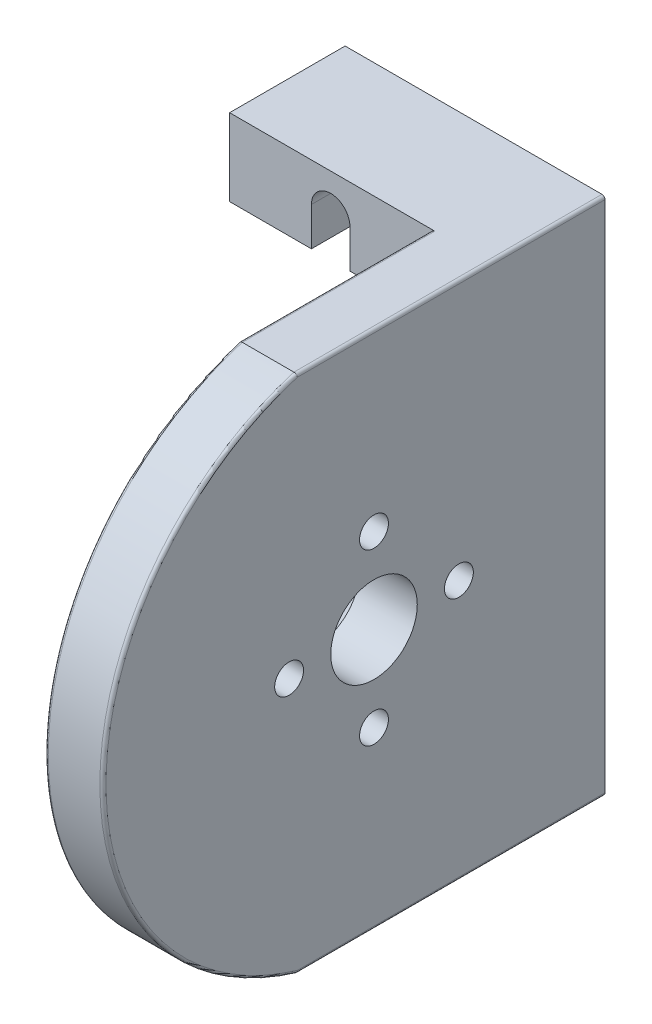
ISO-10303-21;
HEADER;
FILE_DESCRIPTION(('STEP AP214'),'2;1');
FILE_NAME('part.step','',(''),(''),'','','');
FILE_SCHEMA(('AUTOMOTIVE_DESIGN { 1 0 10303 214 1 1 1 1 }'));
ENDSEC;
DATA;
#1=APPLICATION_CONTEXT('core data for automotive mechanical design processes');
#2=APPLICATION_PROTOCOL_DEFINITION('international standard','automotive_design',2000,#1);
#3=PRODUCT_CONTEXT('',#1,'mechanical');
#4=PRODUCT('Part','Part','',(#3));
#5=PRODUCT_RELATED_PRODUCT_CATEGORY('part','',(#4));
#6=PRODUCT_DEFINITION_FORMATION('','',#4);
#7=PRODUCT_DEFINITION_CONTEXT('part definition',#1,'design');
#8=PRODUCT_DEFINITION('design','',#6,#7);
#9=PRODUCT_DEFINITION_SHAPE('','',#8);
#10=(LENGTH_UNIT() NAMED_UNIT(*) SI_UNIT(.MILLI.,.METRE.));
#11=(NAMED_UNIT(*) PLANE_ANGLE_UNIT() SI_UNIT($,.RADIAN.));
#12=(NAMED_UNIT(*) SI_UNIT($,.STERADIAN.) SOLID_ANGLE_UNIT());
#13=UNCERTAINTY_MEASURE_WITH_UNIT(LENGTH_MEASURE(1.E-05),#10,'distance_accuracy_value','');
#14=(GEOMETRIC_REPRESENTATION_CONTEXT(3) GLOBAL_UNCERTAINTY_ASSIGNED_CONTEXT((#13)) GLOBAL_UNIT_ASSIGNED_CONTEXT((#10,
#11,#12)) REPRESENTATION_CONTEXT('',''));
#15=CARTESIAN_POINT('',(0.,0.,0.));
#16=DIRECTION('',(0.,0.,1.));
#17=DIRECTION('',(1.,0.,0.));
#18=AXIS2_PLACEMENT_3D('',#15,#16,#17);
#19=CARTESIAN_POINT('',(0.,36.5125,25.4));
#20=DIRECTION('',(0.,1.,0.));
#21=DIRECTION('',(0.,0.,1.));
#22=AXIS2_PLACEMENT_3D('',#19,#20,#21);
#23=PLANE('',#22);
#24=DIRECTION('',(1.,0.,0.));
#25=VECTOR('',#24,1.);
#26=CARTESIAN_POINT('',(0.,36.5125,0.));
#27=LINE('',#26,#25);
#28=CARTESIAN_POINT('',(9.921875,36.5125,0.));
#29=VERTEX_POINT('',#28);
#30=CARTESIAN_POINT('',(15.08125,36.5125,0.));
#31=VERTEX_POINT('',#30);
#32=EDGE_CURVE('E381',#29,#31,#27,.T.);
#33=ORIENTED_EDGE('',*,*,#32,.T.);
#34=DIRECTION('',(0.,0.,-1.));
#35=VECTOR('',#34,1.);
#36=CARTESIAN_POINT('',(15.08125,36.5125,9.525));
#37=LINE('',#36,#35);
#38=CARTESIAN_POINT('',(15.08125,36.5125,9.525));
#39=VERTEX_POINT('',#38);
#40=EDGE_CURVE('E59',#31,#39,#37,.F.);
#41=ORIENTED_EDGE('',*,*,#40,.T.);
#42=DIRECTION('',(1.,0.,0.));
#43=VECTOR('',#42,1.);
#44=CARTESIAN_POINT('',(0.,36.5125,9.525));
#45=LINE('',#44,#43);
#46=CARTESIAN_POINT('',(9.921875,36.5125,9.525));
#47=VERTEX_POINT('',#46);
#48=EDGE_CURVE('E458',#47,#39,#45,.T.);
#49=ORIENTED_EDGE('',*,*,#48,.F.);
#50=DIRECTION('',(0.,0.,1.));
#51=VECTOR('',#50,1.);
#52=CARTESIAN_POINT('',(9.921875,36.5125,-0.001000000000001));
#53=LINE('',#52,#51);
#54=EDGE_CURVE('E449',#29,#47,#53,.T.);
#55=ORIENTED_EDGE('',*,*,#54,.F.);
#56=EDGE_LOOP('',(#33,#41,#49,#55));
#57=FACE_BOUND('',#56,.T.);
#58=ADVANCED_FACE('F38',(#57),#23,.F.);
#59=CARTESIAN_POINT('',(0.,6.35,25.4));
#60=DIRECTION('',(0.,-1.,0.));
#61=DIRECTION('',(0.,0.,-1.));
#62=AXIS2_PLACEMENT_3D('',#59,#60,#61);
#63=PLANE('',#62);
#64=DIRECTION('',(-1.,0.,0.));
#65=VECTOR('',#64,1.);
#66=CARTESIAN_POINT('',(0.,6.35,9.525));
#67=LINE('',#66,#65);
#68=CARTESIAN_POINT('',(6.746875,6.35,9.525));
#69=VERTEX_POINT('',#68);
#70=CARTESIAN_POINT('',(0.,6.35,9.525));
#71=VERTEX_POINT('',#70);
#72=EDGE_CURVE('E205',#69,#71,#67,.T.);
#73=ORIENTED_EDGE('',*,*,#72,.F.);
#74=DIRECTION('',(0.,0.,1.));
#75=VECTOR('',#74,1.);
#76=CARTESIAN_POINT('',(6.746875,6.35,-0.001000000000001));
#77=LINE('',#76,#75);
#78=CARTESIAN_POINT('',(6.746875,6.35,0.));
#79=VERTEX_POINT('',#78);
#80=EDGE_CURVE('E404',#79,#69,#77,.T.);
#81=ORIENTED_EDGE('',*,*,#80,.F.);
#82=DIRECTION('',(-1.,0.,0.));
#83=VECTOR('',#82,1.);
#84=CARTESIAN_POINT('',(0.,6.35,0.));
#85=LINE('',#84,#83);
#86=CARTESIAN_POINT('',(0.,6.35,0.));
#87=VERTEX_POINT('',#86);
#88=EDGE_CURVE('E392',#79,#87,#85,.T.);
#89=ORIENTED_EDGE('',*,*,#88,.T.);
#90=DIRECTION('',(0.,0.,-1.));
#91=VECTOR('',#90,1.);
#92=CARTESIAN_POINT('',(0.,6.35,25.4));
#93=LINE('',#92,#91);
#94=EDGE_CURVE('E227',#71,#87,#93,.T.);
#95=ORIENTED_EDGE('',*,*,#94,.F.);
#96=EDGE_LOOP('',(#73,#81,#89,#95));
#97=FACE_BOUND('',#96,.T.);
#98=ADVANCED_FACE('F343',(#97),#63,.F.);
#99=CARTESIAN_POINT('',(0.,42.8625,25.4));
#100=DIRECTION('',(1.,0.,0.));
#101=DIRECTION('',(0.,0.,-1.));
#102=AXIS2_PLACEMENT_3D('',#99,#100,#101);
#103=PLANE('',#102);
#104=DIRECTION('',(0.,-1.,0.));
#105=VECTOR('',#104,1.);
#106=CARTESIAN_POINT('',(0.,42.8625,9.525));
#107=LINE('',#106,#105);
#108=CARTESIAN_POINT('',(0.,42.8625,9.525));
#109=VERTEX_POINT('',#108);
#110=CARTESIAN_POINT('',(0.,36.5125,9.525));
#111=VERTEX_POINT('',#110);
#112=EDGE_CURVE('E209',#109,#111,#107,.T.);
#113=ORIENTED_EDGE('',*,*,#112,.F.);
#114=DIRECTION('',(0.,0.,-1.));
#115=VECTOR('',#114,1.);
#116=CARTESIAN_POINT('',(0.,42.8625,25.4));
#117=LINE('',#116,#115);
#118=CARTESIAN_POINT('',(0.,42.8625,0.));
#119=VERTEX_POINT('',#118);
#120=EDGE_CURVE('E239',#109,#119,#117,.T.);
#121=ORIENTED_EDGE('',*,*,#120,.T.);
#122=DIRECTION('',(0.,-1.,0.));
#123=VECTOR('',#122,1.);
#124=CARTESIAN_POINT('',(0.,42.8625,0.));
#125=LINE('',#124,#123);
#126=CARTESIAN_POINT('',(0.,36.5125,0.));
#127=VERTEX_POINT('',#126);
#128=EDGE_CURVE('E378',#119,#127,#125,.T.);
#129=ORIENTED_EDGE('',*,*,#128,.T.);
#130=DIRECTION('',(0.,0.,-1.));
#131=VECTOR('',#130,1.);
#132=CARTESIAN_POINT('',(0.,36.5125,25.4));
#133=LINE('',#132,#131);
#134=EDGE_CURVE('E230',#111,#127,#133,.T.);
#135=ORIENTED_EDGE('',*,*,#134,.F.);
#136=EDGE_LOOP('',(#113,#121,#129,#135));
#137=FACE_BOUND('',#136,.T.);
#138=ADVANCED_FACE('F349',(#137),#103,.F.);
#139=DIRECTION('',(1.,0.,0.));
#140=VECTOR('',#139,1.);
#141=CARTESIAN_POINT('',(0.,36.5125,9.525));
#142=LINE('',#141,#140);
#143=CARTESIAN_POINT('',(6.746875,36.5125,9.525));
#144=VERTEX_POINT('',#143);
#145=EDGE_CURVE('E365',#111,#144,#142,.T.);
#146=ORIENTED_EDGE('',*,*,#145,.F.);
#147=ORIENTED_EDGE('',*,*,#134,.T.);
#148=CARTESIAN_POINT('',(6.746875,36.5125,0.));
#149=VERTEX_POINT('',#148);
#150=EDGE_CURVE('E385',#127,#149,#27,.T.);
#151=ORIENTED_EDGE('',*,*,#150,.T.);
#152=DIRECTION('',(0.,0.,1.));
#153=VECTOR('',#152,1.);
#154=CARTESIAN_POINT('',(6.746875,36.5125,-0.001000000000001));
#155=LINE('',#154,#153);
#156=EDGE_CURVE('E369',#149,#144,#155,.T.);
#157=ORIENTED_EDGE('',*,*,#156,.T.);
#158=EDGE_LOOP('',(#146,#147,#151,#157));
#159=FACE_BOUND('',#158,.T.);
#160=ADVANCED_FACE('F345',(#159),#23,.F.);
#161=DIRECTION('',(-1.,0.,0.));
#162=VECTOR('',#161,1.);
#163=CARTESIAN_POINT('',(0.,6.35,9.525));
#164=LINE('',#163,#162);
#165=CARTESIAN_POINT('',(15.08125,6.35,9.525));
#166=VERTEX_POINT('',#165);
#167=CARTESIAN_POINT('',(9.921875,6.35,9.525));
#168=VERTEX_POINT('',#167);
#169=EDGE_CURVE('E482',#166,#168,#164,.T.);
#170=ORIENTED_EDGE('',*,*,#169,.F.);
#171=DIRECTION('',(0.,0.,-1.));
#172=VECTOR('',#171,1.);
#173=CARTESIAN_POINT('',(15.08125,6.35,0.));
#174=LINE('',#173,#172);
#175=CARTESIAN_POINT('',(15.08125,6.35,0.));
#176=VERTEX_POINT('',#175);
#177=EDGE_CURVE('E278',#166,#176,#174,.T.);
#178=ORIENTED_EDGE('',*,*,#177,.T.);
#179=CARTESIAN_POINT('',(9.921875,6.35,0.));
#180=VERTEX_POINT('',#179);
#181=EDGE_CURVE('E395',#176,#180,#85,.T.);
#182=ORIENTED_EDGE('',*,*,#181,.T.);
#183=DIRECTION('',(0.,0.,1.));
#184=VECTOR('',#183,1.);
#185=CARTESIAN_POINT('',(9.921875,6.35,-0.001000000000001));
#186=LINE('',#185,#184);
#187=EDGE_CURVE('E465',#180,#168,#186,.T.);
#188=ORIENTED_EDGE('',*,*,#187,.T.);
#189=EDGE_LOOP('',(#170,#178,#182,#188));
#190=FACE_BOUND('',#189,.T.);
#191=ADVANCED_FACE('F352',(#190),#63,.F.);
#192=CARTESIAN_POINT('',(0.,0.,25.4));
#193=DIRECTION('',(1.,0.,0.));
#194=DIRECTION('',(0.,0.,-1.));
#195=AXIS2_PLACEMENT_3D('',#192,#193,#194);
#196=PLANE('',#195);
#197=CARTESIAN_POINT('',(0.,0.,9.525));
#198=VERTEX_POINT('',#197);
#199=EDGE_CURVE('E199',#71,#198,#107,.T.);
#200=ORIENTED_EDGE('',*,*,#199,.F.);
#201=ORIENTED_EDGE('',*,*,#94,.T.);
#202=DIRECTION('',(0.,-1.,0.));
#203=VECTOR('',#202,1.);
#204=CARTESIAN_POINT('',(0.,0.,0.));
#205=LINE('',#204,#203);
#206=CARTESIAN_POINT('',(0.,0.,0.));
#207=VERTEX_POINT('',#206);
#208=EDGE_CURVE('E225',#87,#207,#205,.T.);
#209=ORIENTED_EDGE('',*,*,#208,.T.);
#210=DIRECTION('',(0.,0.,-1.));
#211=VECTOR('',#210,1.);
#212=CARTESIAN_POINT('',(0.,0.,25.4));
#213=LINE('',#212,#211);
#214=EDGE_CURVE('E215',#198,#207,#213,.T.);
#215=ORIENTED_EDGE('',*,*,#214,.F.);
#216=EDGE_LOOP('',(#200,#201,#209,#215));
#217=FACE_BOUND('',#216,.T.);
#218=ADVANCED_FACE('F223',(#217),#196,.F.);
#219=CARTESIAN_POINT('',(8.334375,39.68125,-0.001000000000001));
#220=DIRECTION('',(0.,0.,1.));
#221=DIRECTION('',(1.,0.,0.));
#222=AXIS2_PLACEMENT_3D('',#219,#220,#221);
#223=CYLINDRICAL_SURFACE('',#222,1.5875);
#224=CARTESIAN_POINT('',(8.334375,39.68125,9.525));
#225=DIRECTION('',(0.,0.,1.));
#226=DIRECTION('',(1.,0.,0.));
#227=AXIS2_PLACEMENT_3D('',#224,#225,#226);
#228=CIRCLE('',#227,1.5875);
#229=CARTESIAN_POINT('',(6.746875,39.68125,9.525));
#230=VERTEX_POINT('',#229);
#231=CARTESIAN_POINT('',(9.921875,39.68125,9.525));
#232=VERTEX_POINT('',#231);
#233=EDGE_CURVE('E373',#230,#232,#228,.F.);
#234=ORIENTED_EDGE('',*,*,#233,.F.);
#235=DIRECTION('',(0.,0.,1.));
#236=VECTOR('',#235,1.);
#237=CARTESIAN_POINT('',(6.746875,39.68125,-0.001000000000001));
#238=LINE('',#237,#236);
#239=CARTESIAN_POINT('',(6.746875,39.68125,0.));
#240=VERTEX_POINT('',#239);
#241=EDGE_CURVE('E444',#240,#230,#238,.T.);
#242=ORIENTED_EDGE('',*,*,#241,.F.);
#243=CARTESIAN_POINT('',(8.334375,39.68125,0.));
#244=DIRECTION('',(0.,0.,-1.));
#245=DIRECTION('',(-1.,0.,0.));
#246=AXIS2_PLACEMENT_3D('',#243,#244,#245);
#247=CIRCLE('',#246,1.5875);
#248=CARTESIAN_POINT('',(9.921875,39.68125,0.));
#249=VERTEX_POINT('',#248);
#250=EDGE_CURVE('E456',#249,#240,#247,.F.);
#251=ORIENTED_EDGE('',*,*,#250,.F.);
#252=DIRECTION('',(0.,0.,1.));
#253=VECTOR('',#252,1.);
#254=CARTESIAN_POINT('',(9.921875,39.68125,-0.001000000000001));
#255=LINE('',#254,#253);
#256=EDGE_CURVE('E443',#249,#232,#255,.T.);
#257=ORIENTED_EDGE('',*,*,#256,.T.);
#258=EDGE_LOOP('',(#234,#242,#251,#257));
#259=FACE_BOUND('',#258,.T.);
#260=ADVANCED_FACE('F578',(#259),#223,.F.);
#261=CARTESIAN_POINT('',(9.921875,39.68125,-0.001000000000001));
#262=DIRECTION('',(1.,0.,0.));
#263=DIRECTION('',(0.,0.,-1.));
#264=AXIS2_PLACEMENT_3D('',#261,#262,#263);
#265=PLANE('',#264);
#266=DIRECTION('',(0.,-1.,0.));
#267=VECTOR('',#266,1.);
#268=CARTESIAN_POINT('',(9.921875,39.68125,9.525));
#269=LINE('',#268,#267);
#270=EDGE_CURVE('E372',#232,#47,#269,.T.);
#271=ORIENTED_EDGE('',*,*,#270,.F.);
#272=ORIENTED_EDGE('',*,*,#256,.F.);
#273=DIRECTION('',(0.,1.,0.));
#274=VECTOR('',#273,1.);
#275=CARTESIAN_POINT('',(9.921875,39.68125,0.));
#276=LINE('',#275,#274);
#277=EDGE_CURVE('E447',#29,#249,#276,.T.);
#278=ORIENTED_EDGE('',*,*,#277,.F.);
#279=ORIENTED_EDGE('',*,*,#54,.T.);
#280=EDGE_LOOP('',(#271,#272,#278,#279));
#281=FACE_BOUND('',#280,.T.);
#282=ADVANCED_FACE('F575',(#281),#265,.F.);
#283=CARTESIAN_POINT('',(6.746875,39.68125,-0.001000000000001));
#284=DIRECTION('',(-1.,0.,0.));
#285=DIRECTION('',(0.,0.,1.));
#286=AXIS2_PLACEMENT_3D('',#283,#284,#285);
#287=PLANE('',#286);
#288=DIRECTION('',(0.,1.,0.));
#289=VECTOR('',#288,1.);
#290=CARTESIAN_POINT('',(6.746875,39.68125,9.525));
#291=LINE('',#290,#289);
#292=EDGE_CURVE('E477',#144,#230,#291,.T.);
#293=ORIENTED_EDGE('',*,*,#292,.F.);
#294=ORIENTED_EDGE('',*,*,#156,.F.);
#295=DIRECTION('',(0.,-1.,0.));
#296=VECTOR('',#295,1.);
#297=CARTESIAN_POINT('',(6.746875,39.68125,0.));
#298=LINE('',#297,#296);
#299=EDGE_CURVE('E388',#240,#149,#298,.T.);
#300=ORIENTED_EDGE('',*,*,#299,.F.);
#301=ORIENTED_EDGE('',*,*,#241,.T.);
#302=EDGE_LOOP('',(#293,#294,#300,#301));
#303=FACE_BOUND('',#302,.T.);
#304=ADVANCED_FACE('F569',(#303),#287,.F.);
#305=CARTESIAN_POINT('',(8.334375,3.18125,-0.001000000000001));
#306=DIRECTION('',(0.,0.,1.));
#307=DIRECTION('',(1.,0.,0.));
#308=AXIS2_PLACEMENT_3D('',#305,#306,#307);
#309=CYLINDRICAL_SURFACE('',#308,1.5875);
#310=CARTESIAN_POINT('',(8.334375,3.18125,9.525));
#311=DIRECTION('',(0.,0.,1.));
#312=DIRECTION('',(1.,0.,0.));
#313=AXIS2_PLACEMENT_3D('',#310,#311,#312);
#314=CIRCLE('',#313,1.5875);
#315=CARTESIAN_POINT('',(9.921875,3.18125,9.525));
#316=VERTEX_POINT('',#315);
#317=CARTESIAN_POINT('',(6.746875,3.18125,9.525));
#318=VERTEX_POINT('',#317);
#319=EDGE_CURVE('E484',#316,#318,#314,.F.);
#320=ORIENTED_EDGE('',*,*,#319,.F.);
#321=DIRECTION('',(0.,0.,1.));
#322=VECTOR('',#321,1.);
#323=CARTESIAN_POINT('',(9.921875,3.18125,-0.001000000000001));
#324=LINE('',#323,#322);
#325=CARTESIAN_POINT('',(9.921875,3.18125,0.));
#326=VERTEX_POINT('',#325);
#327=EDGE_CURVE('E462',#326,#316,#324,.T.);
#328=ORIENTED_EDGE('',*,*,#327,.F.);
#329=CARTESIAN_POINT('',(8.334375,3.18125,0.));
#330=DIRECTION('',(0.,0.,-1.));
#331=DIRECTION('',(-1.,0.,0.));
#332=AXIS2_PLACEMENT_3D('',#329,#330,#331);
#333=CIRCLE('',#332,1.5875);
#334=CARTESIAN_POINT('',(6.746875,3.18125,0.));
#335=VERTEX_POINT('',#334);
#336=EDGE_CURVE('E442',#335,#326,#333,.F.);
#337=ORIENTED_EDGE('',*,*,#336,.F.);
#338=DIRECTION('',(0.,0.,1.));
#339=VECTOR('',#338,1.);
#340=CARTESIAN_POINT('',(6.746875,3.18125,-0.001000000000001));
#341=LINE('',#340,#339);
#342=EDGE_CURVE('E461',#335,#318,#341,.T.);
#343=ORIENTED_EDGE('',*,*,#342,.T.);
#344=EDGE_LOOP('',(#320,#328,#337,#343));
#345=FACE_BOUND('',#344,.T.);
#346=ADVANCED_FACE('F558',(#345),#309,.F.);
#347=CARTESIAN_POINT('',(6.746875,3.18125,-0.001000000000001));
#348=DIRECTION('',(-1.,0.,0.));
#349=DIRECTION('',(0.,0.,1.));
#350=AXIS2_PLACEMENT_3D('',#347,#348,#349);
#351=PLANE('',#350);
#352=DIRECTION('',(0.,1.,0.));
#353=VECTOR('',#352,1.);
#354=CARTESIAN_POINT('',(6.746875,3.18125,9.525));
#355=LINE('',#354,#353);
#356=EDGE_CURVE('E480',#318,#69,#355,.T.);
#357=ORIENTED_EDGE('',*,*,#356,.F.);
#358=ORIENTED_EDGE('',*,*,#342,.F.);
#359=DIRECTION('',(0.,-1.,0.));
#360=VECTOR('',#359,1.);
#361=CARTESIAN_POINT('',(6.746875,3.18125,0.));
#362=LINE('',#361,#360);
#363=EDGE_CURVE('E466',#79,#335,#362,.T.);
#364=ORIENTED_EDGE('',*,*,#363,.F.);
#365=ORIENTED_EDGE('',*,*,#80,.T.);
#366=EDGE_LOOP('',(#357,#358,#364,#365));
#367=FACE_BOUND('',#366,.T.);
#368=ADVANCED_FACE('F561',(#367),#351,.F.);
#369=CARTESIAN_POINT('',(9.921875,3.18125,-0.001000000000001));
#370=DIRECTION('',(1.,0.,0.));
#371=DIRECTION('',(0.,0.,-1.));
#372=AXIS2_PLACEMENT_3D('',#369,#370,#371);
#373=PLANE('',#372);
#374=DIRECTION('',(0.,-1.,0.));
#375=VECTOR('',#374,1.);
#376=CARTESIAN_POINT('',(9.921875,3.18125,9.525));
#377=LINE('',#376,#375);
#378=EDGE_CURVE('E242',#168,#316,#377,.T.);
#379=ORIENTED_EDGE('',*,*,#378,.F.);
#380=ORIENTED_EDGE('',*,*,#187,.F.);
#381=DIRECTION('',(0.,1.,0.));
#382=VECTOR('',#381,1.);
#383=CARTESIAN_POINT('',(9.921875,3.18125,0.));
#384=LINE('',#383,#382);
#385=EDGE_CURVE('E440',#326,#180,#384,.T.);
#386=ORIENTED_EDGE('',*,*,#385,.F.);
#387=ORIENTED_EDGE('',*,*,#327,.T.);
#388=EDGE_LOOP('',(#379,#380,#386,#387));
#389=FACE_BOUND('',#388,.T.);
#390=ADVANCED_FACE('F553',(#389),#373,.F.);
#391=CARTESIAN_POINT('',(21.43125,0.,25.4));
#392=DIRECTION('',(0.,1.,0.));
#393=DIRECTION('',(-1.,0.,0.));
#394=AXIS2_PLACEMENT_3D('',#391,#392,#393);
#395=PLANE('',#394);
#396=DIRECTION('',(1.,0.,0.));
#397=VECTOR('',#396,1.);
#398=CARTESIAN_POINT('',(21.43125,0.,0.));
#399=LINE('',#398,#397);
#400=CARTESIAN_POINT('',(21.17725,0.,0.));
#401=VERTEX_POINT('',#400);
#402=EDGE_CURVE('E406',#207,#401,#399,.T.);
#403=ORIENTED_EDGE('',*,*,#402,.T.);
#404=DIRECTION('',(0.,0.,-1.));
#405=VECTOR('',#404,1.);
#406=CARTESIAN_POINT('',(21.17725,0.,25.4));
#407=LINE('',#406,#405);
#408=CARTESIAN_POINT('',(21.17725,0.,25.4));
#409=VERTEX_POINT('',#408);
#410=EDGE_CURVE('E267',#401,#409,#407,.F.);
#411=ORIENTED_EDGE('',*,*,#410,.T.);
#412=DIRECTION('',(1.,0.,0.));
#413=VECTOR('',#412,1.);
#414=CARTESIAN_POINT('',(21.43125,0.,25.4));
#415=LINE('',#414,#413);
#416=CARTESIAN_POINT('',(16.92275,0.,25.4));
#417=VERTEX_POINT('',#416);
#418=EDGE_CURVE('E233',#417,#409,#415,.T.);
#419=ORIENTED_EDGE('',*,*,#418,.F.);
#420=DIRECTION('',(0.,0.,1.));
#421=VECTOR('',#420,1.);
#422=CARTESIAN_POINT('',(16.92275,0.,25.4));
#423=LINE('',#422,#421);
#424=CARTESIAN_POINT('',(16.92275,0.,9.525));
#425=VERTEX_POINT('',#424);
#426=EDGE_CURVE('E219',#417,#425,#423,.F.);
#427=ORIENTED_EDGE('',*,*,#426,.T.);
#428=DIRECTION('',(1.,0.,0.));
#429=VECTOR('',#428,1.);
#430=CARTESIAN_POINT('',(0.,0.,9.525));
#431=LINE('',#430,#429);
#432=EDGE_CURVE('E202',#198,#425,#431,.T.);
#433=ORIENTED_EDGE('',*,*,#432,.F.);
#434=ORIENTED_EDGE('',*,*,#214,.T.);
#435=EDGE_LOOP('',(#403,#411,#419,#427,#433,#434));
#436=FACE_BOUND('',#435,.T.);
#437=ADVANCED_FACE('F214',(#436),#395,.F.);
#438=CARTESIAN_POINT('',(21.43125,42.8625,25.4));
#439=DIRECTION('',(-1.,0.,0.));
#440=DIRECTION('',(0.,0.,1.));
#441=AXIS2_PLACEMENT_3D('',#438,#439,#440);
#442=PLANE('',#441);
#443=DIRECTION('',(0.,1.,0.));
#444=VECTOR('',#443,1.);
#445=CARTESIAN_POINT('',(21.43125,42.8625,0.));
#446=LINE('',#445,#444);
#447=CARTESIAN_POINT('',(21.43125,0.253999999999997,0.));
#448=VERTEX_POINT('',#447);
#449=CARTESIAN_POINT('',(21.43125,42.6085,0.));
#450=VERTEX_POINT('',#449);
#451=EDGE_CURVE('E410',#448,#450,#446,.T.);
#452=ORIENTED_EDGE('',*,*,#451,.T.);
#453=DIRECTION('',(0.,0.,-1.));
#454=VECTOR('',#453,1.);
#455=CARTESIAN_POINT('',(21.43125,42.6085,25.4));
#456=LINE('',#455,#454);
#457=CARTESIAN_POINT('',(21.43125,42.6085,25.363054403628));
#458=VERTEX_POINT('',#457);
#459=EDGE_CURVE('E264',#450,#458,#456,.F.);
#460=ORIENTED_EDGE('',*,*,#459,.T.);
#461=CARTESIAN_POINT('',(21.43125,21.43125,19.05));
#462=DIRECTION('',(-1.,0.,0.));
#463=DIRECTION('',(0.,0.,1.));
#464=AXIS2_PLACEMENT_3D('',#461,#462,#463);
#465=CIRCLE('',#464,22.0982029465218);
#466=CARTESIAN_POINT('',(21.43125,0.253999999999997,25.363054403628));
#467=VERTEX_POINT('',#466);
#468=EDGE_CURVE('E260',#458,#467,#465,.F.);
#469=ORIENTED_EDGE('',*,*,#468,.T.);
#470=DIRECTION('',(0.,0.,-1.));
#471=VECTOR('',#470,1.);
#472=CARTESIAN_POINT('',(21.43125,0.253999999999997,25.4));
#473=LINE('',#472,#471);
#474=EDGE_CURVE('E262',#467,#448,#473,.T.);
#475=ORIENTED_EDGE('',*,*,#474,.T.);
#476=EDGE_LOOP('',(#452,#460,#469,#475));
#477=FACE_BOUND('',#476,.T.);
#478=CARTESIAN_POINT('',(21.43125,21.43125,12.05));
#479=DIRECTION('',(1.,0.,0.));
#480=DIRECTION('',(0.,0.,-1.));
#481=AXIS2_PLACEMENT_3D('',#478,#479,#480);
#482=CIRCLE('',#481,1.190625);
#483=CARTESIAN_POINT('',(21.43125,21.43125,10.859375));
#484=VERTEX_POINT('',#483);
#485=EDGE_CURVE('E506',#484,#484,#482,.T.);
#486=ORIENTED_EDGE('',*,*,#485,.F.);
#487=EDGE_LOOP('',(#486));
#488=FACE_BOUND('',#487,.T.);
#489=CARTESIAN_POINT('',(21.43125,14.43125,19.05));
#490=DIRECTION('',(1.,0.,0.));
#491=DIRECTION('',(0.,0.,-1.));
#492=AXIS2_PLACEMENT_3D('',#489,#490,#491);
#493=CIRCLE('',#492,1.190625);
#494=CARTESIAN_POINT('',(21.43125,14.43125,17.859375));
#495=VERTEX_POINT('',#494);
#496=EDGE_CURVE('E500',#495,#495,#493,.T.);
#497=ORIENTED_EDGE('',*,*,#496,.F.);
#498=EDGE_LOOP('',(#497));
#499=FACE_BOUND('',#498,.T.);
#500=CARTESIAN_POINT('',(21.43125,21.43125,26.05));
#501=DIRECTION('',(1.,0.,0.));
#502=DIRECTION('',(0.,0.,-1.));
#503=AXIS2_PLACEMENT_3D('',#500,#501,#502);
#504=CIRCLE('',#503,1.190625);
#505=CARTESIAN_POINT('',(21.43125,21.43125,24.859375));
#506=VERTEX_POINT('',#505);
#507=EDGE_CURVE('E493',#506,#506,#504,.T.);
#508=ORIENTED_EDGE('',*,*,#507,.F.);
#509=EDGE_LOOP('',(#508));
#510=FACE_BOUND('',#509,.T.);
#511=CARTESIAN_POINT('',(21.43125,28.43125,19.05));
#512=DIRECTION('',(1.,0.,0.));
#513=DIRECTION('',(0.,0.,-1.));
#514=AXIS2_PLACEMENT_3D('',#511,#512,#513);
#515=CIRCLE('',#514,1.190625);
#516=CARTESIAN_POINT('',(21.43125,28.43125,17.859375));
#517=VERTEX_POINT('',#516);
#518=EDGE_CURVE('E494',#517,#517,#515,.T.);
#519=ORIENTED_EDGE('',*,*,#518,.F.);
#520=EDGE_LOOP('',(#519));
#521=FACE_BOUND('',#520,.T.);
#522=CARTESIAN_POINT('',(21.43125,21.43125,19.05));
#523=DIRECTION('',(1.,0.,0.));
#524=DIRECTION('',(0.,0.,-1.));
#525=AXIS2_PLACEMENT_3D('',#522,#523,#524);
#526=CIRCLE('',#525,3.5687);
#527=CARTESIAN_POINT('',(21.43125,21.43125,15.4813));
#528=VERTEX_POINT('',#527);
#529=EDGE_CURVE('E416',#528,#528,#526,.T.);
#530=ORIENTED_EDGE('',*,*,#529,.F.);
#531=EDGE_LOOP('',(#530));
#532=FACE_BOUND('',#531,.T.);
#533=ADVANCED_FACE('F425',(#477,#488,#499,#510,#521,#532),#442,.F.);
#534=CARTESIAN_POINT('',(21.43125,42.8625,25.4));
#535=DIRECTION('',(0.,-1.,0.));
#536=DIRECTION('',(0.,0.,-1.));
#537=AXIS2_PLACEMENT_3D('',#534,#535,#536);
#538=PLANE('',#537);
#539=DIRECTION('',(-1.,0.,0.));
#540=VECTOR('',#539,1.);
#541=CARTESIAN_POINT('',(0.,42.8625,9.525));
#542=LINE('',#541,#540);
#543=CARTESIAN_POINT('',(16.92275,42.8625,9.525));
#544=VERTEX_POINT('',#543);
#545=EDGE_CURVE('E486',#544,#109,#542,.T.);
#546=ORIENTED_EDGE('',*,*,#545,.F.);
#547=DIRECTION('',(0.,0.,1.));
#548=VECTOR('',#547,1.);
#549=CARTESIAN_POINT('',(16.92275,42.8625,25.4));
#550=LINE('',#549,#548);
#551=CARTESIAN_POINT('',(16.92275,42.8625,25.4));
#552=VERTEX_POINT('',#551);
#553=EDGE_CURVE('E247',#544,#552,#550,.T.);
#554=ORIENTED_EDGE('',*,*,#553,.T.);
#555=DIRECTION('',(-1.,0.,0.));
#556=VECTOR('',#555,1.);
#557=CARTESIAN_POINT('',(21.43125,42.8625,25.4));
#558=LINE('',#557,#556);
#559=CARTESIAN_POINT('',(21.17725,42.8625,25.4));
#560=VERTEX_POINT('',#559);
#561=EDGE_CURVE('E228',#560,#552,#558,.T.);
#562=ORIENTED_EDGE('',*,*,#561,.F.);
#563=DIRECTION('',(0.,0.,-1.));
#564=VECTOR('',#563,1.);
#565=CARTESIAN_POINT('',(21.17725,42.8625,25.4));
#566=LINE('',#565,#564);
#567=CARTESIAN_POINT('',(21.17725,42.8625,0.));
#568=VERTEX_POINT('',#567);
#569=EDGE_CURVE('E244',#560,#568,#566,.T.);
#570=ORIENTED_EDGE('',*,*,#569,.T.);
#571=DIRECTION('',(-1.,0.,0.));
#572=VECTOR('',#571,1.);
#573=CARTESIAN_POINT('',(21.43125,42.8625,0.));
#574=LINE('',#573,#572);
#575=EDGE_CURVE('E382',#568,#119,#574,.T.);
#576=ORIENTED_EDGE('',*,*,#575,.T.);
#577=ORIENTED_EDGE('',*,*,#120,.F.);
#578=EDGE_LOOP('',(#546,#554,#562,#570,#576,#577));
#579=FACE_BOUND('',#578,.T.);
#580=ADVANCED_FACE('F420',(#579),#538,.F.);
#581=CARTESIAN_POINT('',(16.66875,6.35,25.4));
#582=DIRECTION('',(1.,0.,0.));
#583=DIRECTION('',(0.,1.,0.));
#584=AXIS2_PLACEMENT_3D('',#581,#582,#583);
#585=PLANE('',#584);
#586=CARTESIAN_POINT('',(16.66875,21.43125,12.05));
#587=DIRECTION('',(1.,0.,0.));
#588=DIRECTION('',(0.,1.,0.));
#589=AXIS2_PLACEMENT_3D('',#586,#587,#588);
#590=CIRCLE('',#589,1.190625);
#591=CARTESIAN_POINT('',(16.66875,22.621875,12.05));
#592=VERTEX_POINT('',#591);
#593=EDGE_CURVE('E210',#592,#592,#590,.F.);
#594=ORIENTED_EDGE('',*,*,#593,.F.);
#595=EDGE_LOOP('',(#594));
#596=FACE_BOUND('',#595,.T.);
#597=CARTESIAN_POINT('',(16.66875,14.43125,19.05));
#598=DIRECTION('',(1.,0.,0.));
#599=DIRECTION('',(0.,1.,0.));
#600=AXIS2_PLACEMENT_3D('',#597,#598,#599);
#601=CIRCLE('',#600,1.190625);
#602=CARTESIAN_POINT('',(16.66875,15.621875,19.05));
#603=VERTEX_POINT('',#602);
#604=EDGE_CURVE('E503',#603,#603,#601,.F.);
#605=ORIENTED_EDGE('',*,*,#604,.F.);
#606=EDGE_LOOP('',(#605));
#607=FACE_BOUND('',#606,.T.);
#608=CARTESIAN_POINT('',(16.66875,21.43125,26.05));
#609=DIRECTION('',(1.,0.,0.));
#610=DIRECTION('',(0.,1.,0.));
#611=AXIS2_PLACEMENT_3D('',#608,#609,#610);
#612=CIRCLE('',#611,1.190625);
#613=CARTESIAN_POINT('',(16.66875,22.621875,26.05));
#614=VERTEX_POINT('',#613);
#615=EDGE_CURVE('E497',#614,#614,#612,.F.);
#616=ORIENTED_EDGE('',*,*,#615,.F.);
#617=EDGE_LOOP('',(#616));
#618=FACE_BOUND('',#617,.T.);
#619=CARTESIAN_POINT('',(16.66875,28.43125,19.05));
#620=DIRECTION('',(1.,0.,0.));
#621=DIRECTION('',(0.,1.,0.));
#622=AXIS2_PLACEMENT_3D('',#619,#620,#621);
#623=CIRCLE('',#622,1.190625);
#624=CARTESIAN_POINT('',(16.66875,29.621875,19.05));
#625=VERTEX_POINT('',#624);
#626=EDGE_CURVE('E490',#625,#625,#623,.F.);
#627=ORIENTED_EDGE('',*,*,#626,.F.);
#628=EDGE_LOOP('',(#627));
#629=FACE_BOUND('',#628,.T.);
#630=CARTESIAN_POINT('',(16.66875,21.43125,19.05));
#631=DIRECTION('',(1.,0.,0.));
#632=DIRECTION('',(0.,1.,0.));
#633=AXIS2_PLACEMENT_3D('',#630,#631,#632);
#634=CIRCLE('',#633,3.5687);
#635=CARTESIAN_POINT('',(16.66875,24.99995,19.05));
#636=VERTEX_POINT('',#635);
#637=EDGE_CURVE('E411',#636,#636,#634,.F.);
#638=ORIENTED_EDGE('',*,*,#637,.F.);
#639=EDGE_LOOP('',(#638));
#640=FACE_BOUND('',#639,.T.);
#641=DIRECTION('',(0.,-1.,0.));
#642=VECTOR('',#641,1.);
#643=CARTESIAN_POINT('',(16.66875,6.35,0.));
#644=LINE('',#643,#642);
#645=CARTESIAN_POINT('',(16.66875,34.925,0.));
#646=VERTEX_POINT('',#645);
#647=CARTESIAN_POINT('',(16.66875,7.9375,0.));
#648=VERTEX_POINT('',#647);
#649=EDGE_CURVE('E389',#646,#648,#644,.T.);
#650=ORIENTED_EDGE('',*,*,#649,.T.);
#651=DIRECTION('',(0.,0.,-1.));
#652=VECTOR('',#651,1.);
#653=CARTESIAN_POINT('',(16.66875,7.9375,9.525));
#654=LINE('',#653,#652);
#655=CARTESIAN_POINT('',(16.66875,7.9375,9.525));
#656=VERTEX_POINT('',#655);
#657=EDGE_CURVE('E540',#648,#656,#654,.F.);
#658=ORIENTED_EDGE('',*,*,#657,.T.);
#659=DIRECTION('',(0.,1.,0.));
#660=VECTOR('',#659,1.);
#661=CARTESIAN_POINT('',(16.66875,42.8625,9.525));
#662=LINE('',#661,#660);
#663=CARTESIAN_POINT('',(16.66875,0.253999999999997,9.525));
#664=VERTEX_POINT('',#663);
#665=EDGE_CURVE('E488',#664,#656,#662,.T.);
#666=ORIENTED_EDGE('',*,*,#665,.F.);
#667=DIRECTION('',(0.,0.,1.));
#668=VECTOR('',#667,1.);
#669=CARTESIAN_POINT('',(16.66875,0.254,25.4));
#670=LINE('',#669,#668);
#671=CARTESIAN_POINT('',(16.66875,0.254,25.363054403628));
#672=VERTEX_POINT('',#671);
#673=EDGE_CURVE('E252',#664,#672,#670,.T.);
#674=ORIENTED_EDGE('',*,*,#673,.T.);
#675=CARTESIAN_POINT('',(16.66875,21.43125,19.05));
#676=DIRECTION('',(1.,0.,0.));
#677=DIRECTION('',(0.,1.,0.));
#678=AXIS2_PLACEMENT_3D('',#675,#676,#677);
#679=CIRCLE('',#678,22.0982029465218);
#680=CARTESIAN_POINT('',(16.66875,42.6085,25.363054403628));
#681=VERTEX_POINT('',#680);
#682=EDGE_CURVE('E250',#672,#681,#679,.F.);
#683=ORIENTED_EDGE('',*,*,#682,.T.);
#684=DIRECTION('',(0.,0.,1.));
#685=VECTOR('',#684,1.);
#686=CARTESIAN_POINT('',(16.66875,42.6085,25.4));
#687=LINE('',#686,#685);
#688=CARTESIAN_POINT('',(16.66875,42.6085,9.525));
#689=VERTEX_POINT('',#688);
#690=EDGE_CURVE('E254',#681,#689,#687,.F.);
#691=ORIENTED_EDGE('',*,*,#690,.T.);
#692=CARTESIAN_POINT('',(16.66875,34.925,9.525));
#693=VERTEX_POINT('',#692);
#694=EDGE_CURVE('E221',#693,#689,#662,.T.);
#695=ORIENTED_EDGE('',*,*,#694,.F.);
#696=DIRECTION('',(0.,0.,-1.));
#697=VECTOR('',#696,1.);
#698=CARTESIAN_POINT('',(16.66875,34.925,0.));
#699=LINE('',#698,#697);
#700=EDGE_CURVE('E542',#693,#646,#699,.T.);
#701=ORIENTED_EDGE('',*,*,#700,.T.);
#702=EDGE_LOOP('',(#650,#658,#666,#674,#683,#691,#695,#701));
#703=FACE_BOUND('',#702,.T.);
#704=ADVANCED_FACE('F532',(#596,#607,#618,#629,#640,#703),#585,.F.);
#705=CARTESIAN_POINT('',(0.,0.,0.));
#706=DIRECTION('',(0.,0.,-1.));
#707=DIRECTION('',(-1.,0.,0.));
#708=AXIS2_PLACEMENT_3D('',#705,#706,#707);
#709=PLANE('',#708);
#710=ORIENTED_EDGE('',*,*,#575,.F.);
#711=CARTESIAN_POINT('',(21.17725,42.6085,0.));
#712=DIRECTION('',(0.,0.,-1.));
#713=DIRECTION('',(-1.,0.,0.));
#714=AXIS2_PLACEMENT_3D('',#711,#712,#713);
#715=CIRCLE('',#714,0.254);
#716=EDGE_CURVE('E258',#568,#450,#715,.T.);
#717=ORIENTED_EDGE('',*,*,#716,.T.);
#718=ORIENTED_EDGE('',*,*,#451,.F.);
#719=CARTESIAN_POINT('',(21.17725,0.253999999999997,0.));
#720=DIRECTION('',(0.,0.,-1.));
#721=DIRECTION('',(-1.,0.,0.));
#722=AXIS2_PLACEMENT_3D('',#719,#720,#721);
#723=CIRCLE('',#722,0.254);
#724=EDGE_CURVE('E256',#448,#401,#723,.T.);
#725=ORIENTED_EDGE('',*,*,#724,.T.);
#726=ORIENTED_EDGE('',*,*,#402,.F.);
#727=ORIENTED_EDGE('',*,*,#208,.F.);
#728=ORIENTED_EDGE('',*,*,#88,.F.);
#729=ORIENTED_EDGE('',*,*,#363,.T.);
#730=ORIENTED_EDGE('',*,*,#336,.T.);
#731=ORIENTED_EDGE('',*,*,#385,.T.);
#732=ORIENTED_EDGE('',*,*,#181,.F.);
#733=CARTESIAN_POINT('',(15.08125,7.9375,0.));
#734=DIRECTION('',(0.,0.,-1.));
#735=DIRECTION('',(-1.,0.,0.));
#736=AXIS2_PLACEMENT_3D('',#733,#734,#735);
#737=CIRCLE('',#736,1.5875);
#738=EDGE_CURVE('E544',#176,#648,#737,.F.);
#739=ORIENTED_EDGE('',*,*,#738,.T.);
#740=ORIENTED_EDGE('',*,*,#649,.F.);
#741=CARTESIAN_POINT('',(15.08125,34.925,0.));
#742=DIRECTION('',(0.,0.,-1.));
#743=DIRECTION('',(-1.,0.,0.));
#744=AXIS2_PLACEMENT_3D('',#741,#742,#743);
#745=CIRCLE('',#744,1.5875);
#746=EDGE_CURVE('E46',#646,#31,#745,.F.);
#747=ORIENTED_EDGE('',*,*,#746,.T.);
#748=ORIENTED_EDGE('',*,*,#32,.F.);
#749=ORIENTED_EDGE('',*,*,#277,.T.);
#750=ORIENTED_EDGE('',*,*,#250,.T.);
#751=ORIENTED_EDGE('',*,*,#299,.T.);
#752=ORIENTED_EDGE('',*,*,#150,.F.);
#753=ORIENTED_EDGE('',*,*,#128,.F.);
#754=EDGE_LOOP('',(#710,#717,#718,#725,#726,#727,#728,#729,#730,#731,#732,#739,#740,#747,#748,
#749,#750,#751,#752,#753));
#755=FACE_BOUND('',#754,.T.);
#756=ADVANCED_FACE('F386',(#755),#709,.T.);
#757=CARTESIAN_POINT('',(-0.001000000000001,21.43125,19.05));
#758=DIRECTION('',(1.,0.,0.));
#759=DIRECTION('',(0.,0.,-1.));
#760=AXIS2_PLACEMENT_3D('',#757,#758,#759);
#761=CYLINDRICAL_SURFACE('',#760,3.5687);
#762=ORIENTED_EDGE('',*,*,#529,.T.);
#763=EDGE_LOOP('',(#762));
#764=FACE_BOUND('',#763,.T.);
#765=ORIENTED_EDGE('',*,*,#637,.T.);
#766=EDGE_LOOP('',(#765));
#767=FACE_BOUND('',#766,.T.);
#768=ADVANCED_FACE('F526',(#764,#767),#761,.F.);
#769=CARTESIAN_POINT('',(0.,0.,9.525));
#770=DIRECTION('',(0.,0.,1.));
#771=DIRECTION('',(1.,0.,0.));
#772=AXIS2_PLACEMENT_3D('',#769,#770,#771);
#773=PLANE('',#772);
#774=ORIENTED_EDGE('',*,*,#72,.T.);
#775=ORIENTED_EDGE('',*,*,#199,.T.);
#776=ORIENTED_EDGE('',*,*,#432,.T.);
#777=CARTESIAN_POINT('',(16.92275,0.254,9.525));
#778=DIRECTION('',(0.,0.,1.));
#779=DIRECTION('',(1.,0.,0.));
#780=AXIS2_PLACEMENT_3D('',#777,#778,#779);
#781=CIRCLE('',#780,0.254);
#782=EDGE_CURVE('E276',#425,#664,#781,.F.);
#783=ORIENTED_EDGE('',*,*,#782,.T.);
#784=ORIENTED_EDGE('',*,*,#665,.T.);
#785=CARTESIAN_POINT('',(15.08125,7.9375,9.525));
#786=DIRECTION('',(0.,0.,1.));
#787=DIRECTION('',(1.,0.,0.));
#788=AXIS2_PLACEMENT_3D('',#785,#786,#787);
#789=CIRCLE('',#788,1.5875);
#790=EDGE_CURVE('E545',#656,#166,#789,.F.);
#791=ORIENTED_EDGE('',*,*,#790,.T.);
#792=ORIENTED_EDGE('',*,*,#169,.T.);
#793=ORIENTED_EDGE('',*,*,#378,.T.);
#794=ORIENTED_EDGE('',*,*,#319,.T.);
#795=ORIENTED_EDGE('',*,*,#356,.T.);
#796=EDGE_LOOP('',(#774,#775,#776,#783,#784,#791,#792,#793,#794,#795));
#797=FACE_BOUND('',#796,.T.);
#798=ADVANCED_FACE('F201',(#797),#773,.T.);
#799=ORIENTED_EDGE('',*,*,#48,.T.);
#800=CARTESIAN_POINT('',(15.08125,34.925,9.525));
#801=DIRECTION('',(0.,0.,1.));
#802=DIRECTION('',(1.,0.,0.));
#803=AXIS2_PLACEMENT_3D('',#800,#801,#802);
#804=CIRCLE('',#803,1.5875);
#805=EDGE_CURVE('E11',#39,#693,#804,.F.);
#806=ORIENTED_EDGE('',*,*,#805,.T.);
#807=ORIENTED_EDGE('',*,*,#694,.T.);
#808=CARTESIAN_POINT('',(16.92275,42.6085,9.525));
#809=DIRECTION('',(0.,0.,1.));
#810=DIRECTION('',(1.,0.,0.));
#811=AXIS2_PLACEMENT_3D('',#808,#809,#810);
#812=CIRCLE('',#811,0.254);
#813=EDGE_CURVE('E273',#689,#544,#812,.F.);
#814=ORIENTED_EDGE('',*,*,#813,.T.);
#815=ORIENTED_EDGE('',*,*,#545,.T.);
#816=ORIENTED_EDGE('',*,*,#112,.T.);
#817=ORIENTED_EDGE('',*,*,#145,.T.);
#818=ORIENTED_EDGE('',*,*,#292,.T.);
#819=ORIENTED_EDGE('',*,*,#233,.T.);
#820=ORIENTED_EDGE('',*,*,#270,.T.);
#821=EDGE_LOOP('',(#799,#806,#807,#814,#815,#816,#817,#818,#819,#820));
#822=FACE_BOUND('',#821,.T.);
#823=ADVANCED_FACE('F572',(#822),#773,.T.);
#824=CARTESIAN_POINT('',(-29.0834565630902,21.43125,19.05));
#825=DIRECTION('',(1.,0.,0.));
#826=DIRECTION('',(0.,0.,-1.));
#827=AXIS2_PLACEMENT_3D('',#824,#825,#826);
#828=CYLINDRICAL_SURFACE('',#827,22.3522029465218);
#829=ORIENTED_EDGE('',*,*,#418,.T.);
#830=CARTESIAN_POINT('',(21.17725,21.43125,19.05));
#831=DIRECTION('',(-1.,0.,0.));
#832=DIRECTION('',(0.,0.,1.));
#833=AXIS2_PLACEMENT_3D('',#830,#831,#832);
#834=CIRCLE('',#833,22.3522029465218);
#835=EDGE_CURVE('E271',#409,#560,#834,.T.);
#836=ORIENTED_EDGE('',*,*,#835,.T.);
#837=ORIENTED_EDGE('',*,*,#561,.T.);
#838=CARTESIAN_POINT('',(16.92275,21.43125,19.05));
#839=DIRECTION('',(1.,0.,0.));
#840=DIRECTION('',(0.,1.,0.));
#841=AXIS2_PLACEMENT_3D('',#838,#839,#840);
#842=CIRCLE('',#841,22.3522029465218);
#843=EDGE_CURVE('E269',#552,#417,#842,.T.);
#844=ORIENTED_EDGE('',*,*,#843,.T.);
#845=EDGE_LOOP('',(#829,#836,#837,#844));
#846=FACE_BOUND('',#845,.T.);
#847=ADVANCED_FACE('F435',(#846),#828,.T.);
#848=CARTESIAN_POINT('',(-0.001000000000001,28.43125,19.05));
#849=DIRECTION('',(1.,0.,0.));
#850=DIRECTION('',(0.,0.,-1.));
#851=AXIS2_PLACEMENT_3D('',#848,#849,#850);
#852=CYLINDRICAL_SURFACE('',#851,1.190625);
#853=ORIENTED_EDGE('',*,*,#518,.T.);
#854=EDGE_LOOP('',(#853));
#855=FACE_BOUND('',#854,.T.);
#856=ORIENTED_EDGE('',*,*,#626,.T.);
#857=EDGE_LOOP('',(#856));
#858=FACE_BOUND('',#857,.T.);
#859=ADVANCED_FACE('F666',(#855,#858),#852,.F.);
#860=CARTESIAN_POINT('',(-0.001000000000001,21.43125,26.05));
#861=DIRECTION('',(1.,0.,0.));
#862=DIRECTION('',(0.,0.,-1.));
#863=AXIS2_PLACEMENT_3D('',#860,#861,#862);
#864=CYLINDRICAL_SURFACE('',#863,1.190625);
#865=ORIENTED_EDGE('',*,*,#507,.T.);
#866=EDGE_LOOP('',(#865));
#867=FACE_BOUND('',#866,.T.);
#868=ORIENTED_EDGE('',*,*,#615,.T.);
#869=EDGE_LOOP('',(#868));
#870=FACE_BOUND('',#869,.T.);
#871=ADVANCED_FACE('F673',(#867,#870),#864,.F.);
#872=CARTESIAN_POINT('',(-0.001000000000001,14.43125,19.05));
#873=DIRECTION('',(1.,0.,0.));
#874=DIRECTION('',(0.,0.,-1.));
#875=AXIS2_PLACEMENT_3D('',#872,#873,#874);
#876=CYLINDRICAL_SURFACE('',#875,1.190625);
#877=ORIENTED_EDGE('',*,*,#496,.T.);
#878=EDGE_LOOP('',(#877));
#879=FACE_BOUND('',#878,.T.);
#880=ORIENTED_EDGE('',*,*,#604,.T.);
#881=EDGE_LOOP('',(#880));
#882=FACE_BOUND('',#881,.T.);
#883=ADVANCED_FACE('F681',(#879,#882),#876,.F.);
#884=CARTESIAN_POINT('',(-0.001000000000001,21.43125,12.05));
#885=DIRECTION('',(1.,0.,0.));
#886=DIRECTION('',(0.,0.,-1.));
#887=AXIS2_PLACEMENT_3D('',#884,#885,#886);
#888=CYLINDRICAL_SURFACE('',#887,1.190625);
#889=ORIENTED_EDGE('',*,*,#485,.T.);
#890=EDGE_LOOP('',(#889));
#891=FACE_BOUND('',#890,.T.);
#892=ORIENTED_EDGE('',*,*,#593,.T.);
#893=EDGE_LOOP('',(#892));
#894=FACE_BOUND('',#893,.T.);
#895=ADVANCED_FACE('F307',(#891,#894),#888,.F.);
#896=CARTESIAN_POINT('',(16.92275,0.254,25.4));
#897=DIRECTION('',(0.,0.,1.));
#898=DIRECTION('',(1.,0.,0.));
#899=AXIS2_PLACEMENT_3D('',#896,#897,#898);
#900=CYLINDRICAL_SURFACE('',#899,0.254);
#901=ORIENTED_EDGE('',*,*,#782,.F.);
#902=ORIENTED_EDGE('',*,*,#426,.F.);
#903=CARTESIAN_POINT('',(16.92275,0.,25.4));
#904=CARTESIAN_POINT('',(16.9085681470834,-1.26225727830249E-05,25.4000018027631));
#905=CARTESIAN_POINT('',(16.8943907910485,0.00118696472633387,25.3998278517572));
#906=CARTESIAN_POINT('',(16.8664527510322,0.00591655108904327,25.3991418696473));
#907=CARTESIAN_POINT('',(16.8526916604588,0.00944419391633272,25.3986301803698));
#908=CARTESIAN_POINT('',(16.8259585347537,0.0187379833368968,25.3972818452885));
#909=CARTESIAN_POINT('',(16.8129867993107,0.0245049740691864,25.3964450769435));
#910=CARTESIAN_POINT('',(16.7882018260851,0.0381008720863135,25.3944718263437));
#911=CARTESIAN_POINT('',(16.776388406664,0.0459294553755244,25.3933353911837));
#912=CARTESIAN_POINT('',(16.7541923750471,0.0634605970414666,25.3907896332552));
#913=CARTESIAN_POINT('',(16.7438164014019,0.0731713836478425,25.3893791122233));
#914=CARTESIAN_POINT('',(16.7248361485884,0.0941674952491011,25.3863281684631));
#915=CARTESIAN_POINT('',(16.716232524667,0.105453399995832,25.3846876610829));
#916=CARTESIAN_POINT('',(16.7009534289466,0.129396275127654,25.3812058328277));
#917=CARTESIAN_POINT('',(16.6942982858107,0.142065929311653,25.3793626529457));
#918=CARTESIAN_POINT('',(16.6832144513755,0.168318478232947,25.375541624104));
#919=CARTESIAN_POINT('',(16.6787839314669,0.181900612476754,25.3735638872719));
#920=CARTESIAN_POINT('',(16.6734969570869,0.204330414514679,25.3702962100764));
#921=CARTESIAN_POINT('',(16.6719222659926,0.213019672298759,25.3690299446996));
#922=CARTESIAN_POINT('',(16.6696860929033,0.230503861916315,25.366481235196));
#923=CARTESIAN_POINT('',(16.6690232617911,0.239298618172181,25.3651988178096));
#924=CARTESIAN_POINT('',(16.668772805148,0.250065852319176,25.3636283005138));
#925=CARTESIAN_POINT('',(16.668749938506,0.252033087695086,25.3633413383854));
#926=CARTESIAN_POINT('',(16.66875,0.254,25.363054403628));
#927=B_SPLINE_CURVE_WITH_KNOTS('',3,(#903,#904,#905,#906,#907,#908,#909,#910,#911,#912,#913,
#914,#915,#916,#917,#918,#919,#920,#921,#922,#923,#924,#925,#926),.UNSPECIFIED.,.F.,.F.,(4,2,2,
2,2,2,2,2,2,2,2,4),(0.,0.0424872436048956,0.0849315514769382,0.127391874606188,
0.169845528736984,0.212489138574499,0.255148485792569,0.298238218928517,0.341292474683803,
0.36801507625521,0.394698098468451,0.40066205217944),.UNSPECIFIED.);
#928=EDGE_CURVE('E287',#672,#417,#927,.F.);
#929=ORIENTED_EDGE('',*,*,#928,.F.);
#930=ORIENTED_EDGE('',*,*,#673,.F.);
#931=EDGE_LOOP('',(#901,#902,#929,#930));
#932=FACE_BOUND('',#931,.T.);
#933=ADVANCED_FACE('F303',(#932),#900,.T.);
#934=CARTESIAN_POINT('',(16.92275,21.43125,19.05));
#935=DIRECTION('',(1.,0.,0.));
#936=DIRECTION('',(0.,1.,0.));
#937=AXIS2_PLACEMENT_3D('',#934,#935,#936);
#938=TOROIDAL_SURFACE('',#937,22.0982029465218,0.254);
#939=ORIENTED_EDGE('',*,*,#928,.T.);
#940=ORIENTED_EDGE('',*,*,#843,.F.);
#941=CARTESIAN_POINT('',(16.92275,42.8625,25.4));
#942=CARTESIAN_POINT('',(16.9085681470834,42.8625126225728,25.4000018027631));
#943=CARTESIAN_POINT('',(16.8943907910485,42.8613130352737,25.3998278517572));
#944=CARTESIAN_POINT('',(16.8664527510322,42.856583448911,25.3991418696473));
#945=CARTESIAN_POINT('',(16.8526916604588,42.8530558060837,25.3986301803698));
#946=CARTESIAN_POINT('',(16.8259585347537,42.8437620166631,25.3972818452884));
#947=CARTESIAN_POINT('',(16.8129867993107,42.8379950259308,25.3964450769435));
#948=CARTESIAN_POINT('',(16.7882018260851,42.8243991279137,25.3944718263437));
#949=CARTESIAN_POINT('',(16.7763884066639,42.8165705446245,25.3933353911838));
#950=CARTESIAN_POINT('',(16.7541923750471,42.7990394029585,25.3907896332552));
#951=CARTESIAN_POINT('',(16.7438164014019,42.7893286163522,25.3893791122233));
#952=CARTESIAN_POINT('',(16.7248361485884,42.7683325047509,25.386328168463));
#953=CARTESIAN_POINT('',(16.716232524667,42.7570466000042,25.3846876610829));
#954=CARTESIAN_POINT('',(16.7009534289466,42.7331037248724,25.3812058328277));
#955=CARTESIAN_POINT('',(16.6942982858107,42.7204340706884,25.3793626529457));
#956=CARTESIAN_POINT('',(16.6832144513755,42.6941815217671,25.375541624104));
#957=CARTESIAN_POINT('',(16.6787839314669,42.6805993875233,25.3735638872719));
#958=CARTESIAN_POINT('',(16.6734969570869,42.6581695854853,25.3702962100764));
#959=CARTESIAN_POINT('',(16.6719222659926,42.6494803277013,25.3690299446995));
#960=CARTESIAN_POINT('',(16.6696860929033,42.6319961380837,25.3664812351961));
#961=CARTESIAN_POINT('',(16.6690232617911,42.6232013818278,25.36519881781));
#962=CARTESIAN_POINT('',(16.668772805148,42.6124341476808,25.363628300514));
#963=CARTESIAN_POINT('',(16.668749938506,42.6104669123049,25.3633413383854));
#964=CARTESIAN_POINT('',(16.66875,42.6085,25.363054403628));
#965=B_SPLINE_CURVE_WITH_KNOTS('',3,(#941,#942,#943,#944,#945,#946,#947,#948,#949,#950,#951,
#952,#953,#954,#955,#956,#957,#958,#959,#960,#961,#962,#963,#964),.UNSPECIFIED.,.F.,.F.,(4,2,2,
2,2,2,2,2,2,2,2,4),(0.,0.0424872436048957,0.0849315514769379,0.127391874606191,
0.169845528736986,0.212489138574496,0.255148485792565,0.298238218928512,0.341292474683798,
0.368015076255204,0.394698098468455,0.400662052179444),.UNSPECIFIED.);
#966=EDGE_CURVE('E279',#681,#552,#965,.F.);
#967=ORIENTED_EDGE('',*,*,#966,.F.);
#968=ORIENTED_EDGE('',*,*,#682,.F.);
#969=EDGE_LOOP('',(#939,#940,#967,#968));
#970=FACE_BOUND('',#969,.T.);
#971=ADVANCED_FACE('F295',(#970),#938,.T.);
#972=CARTESIAN_POINT('',(16.92275,42.6085,25.4));
#973=DIRECTION('',(0.,0.,1.));
#974=DIRECTION('',(1.,0.,0.));
#975=AXIS2_PLACEMENT_3D('',#972,#973,#974);
#976=CYLINDRICAL_SURFACE('',#975,0.254);
#977=ORIENTED_EDGE('',*,*,#813,.F.);
#978=ORIENTED_EDGE('',*,*,#690,.F.);
#979=ORIENTED_EDGE('',*,*,#966,.T.);
#980=ORIENTED_EDGE('',*,*,#553,.F.);
#981=EDGE_LOOP('',(#977,#978,#979,#980));
#982=FACE_BOUND('',#981,.T.);
#983=ADVANCED_FACE('F298',(#982),#976,.T.);
#984=CARTESIAN_POINT('',(21.17725,0.253999999999997,25.4));
#985=DIRECTION('',(0.,0.,-1.));
#986=DIRECTION('',(-1.,0.,0.));
#987=AXIS2_PLACEMENT_3D('',#984,#985,#986);
#988=CYLINDRICAL_SURFACE('',#987,0.254);
#989=ORIENTED_EDGE('',*,*,#724,.F.);
#990=ORIENTED_EDGE('',*,*,#474,.F.);
#991=CARTESIAN_POINT('',(21.17725,0.,25.4));
#992=CARTESIAN_POINT('',(21.1914318529166,-1.26225727845866E-05,25.4000018027631));
#993=CARTESIAN_POINT('',(21.2056092089515,0.00118696472633185,25.3998278517572));
#994=CARTESIAN_POINT('',(21.2335472489678,0.00591655108904122,25.3991418696473));
#995=CARTESIAN_POINT('',(21.2473083395412,0.00944419391633111,25.3986301803698));
#996=CARTESIAN_POINT('',(21.2740414652463,0.0187379833368957,25.3972818452884));
#997=CARTESIAN_POINT('',(21.2870132006893,0.0245049740691852,25.3964450769435));
#998=CARTESIAN_POINT('',(21.3117981739149,0.0381008720863128,25.3944718263437));
#999=CARTESIAN_POINT('',(21.3236115933361,0.0459294553755243,25.3933353911838));
#1000=CARTESIAN_POINT('',(21.3458076249529,0.063460597041467,25.3907896332552));
#1001=CARTESIAN_POINT('',(21.3561835985981,0.0731713836478429,25.3893791122233));
#1002=CARTESIAN_POINT('',(21.3751638514116,0.0941674952491028,25.3863281684631));
#1003=CARTESIAN_POINT('',(21.383767475333,0.105453399995835,25.3846876610829));
#1004=CARTESIAN_POINT('',(21.3990465710534,0.129396275127655,25.3812058328277));
#1005=CARTESIAN_POINT('',(21.4057017141893,0.142065929311652,25.3793626529457));
#1006=CARTESIAN_POINT('',(21.4167855486245,0.168318478232963,25.3755416241041));
#1007=CARTESIAN_POINT('',(21.4212160685331,0.18190061247679,25.3735638872721));
#1008=CARTESIAN_POINT('',(21.4265030429131,0.204330414514671,25.3702962100764));
#1009=CARTESIAN_POINT('',(21.4280777340074,0.213019672298716,25.3690299446993));
#1010=CARTESIAN_POINT('',(21.4303139070967,0.230503861916398,25.3664812351966));
#1011=CARTESIAN_POINT('',(21.4309767382089,0.239298618172426,25.3651988178113));
#1012=CARTESIAN_POINT('',(21.431227194852,0.250065852319273,25.3636283005145));
#1013=CARTESIAN_POINT('',(21.431250061494,0.252033087695143,25.3633413383857));
#1014=CARTESIAN_POINT('',(21.43125,0.253999999999997,25.363054403628));
#1015=B_SPLINE_CURVE_WITH_KNOTS('',3,(#991,#992,#993,#994,#995,#996,#997,#998,#999,#1000,#1001,
#1002,#1003,#1004,#1005,#1006,#1007,#1008,#1009,#1010,#1011,#1012,#1013,#1014),.UNSPECIFIED.,
.F.,.F.,(4,2,2,2,2,2,2,2,2,2,2,4),(0.,0.0424872436048957,0.0849315514769383,0.127391874606188,
0.169845528736983,0.212489138574499,0.255148485792569,0.298238218928518,0.341292474683804,
0.368015076255208,0.394698098468448,0.400662052179438),.UNSPECIFIED.);
#1016=EDGE_CURVE('E288',#409,#467,#1015,.T.);
#1017=ORIENTED_EDGE('',*,*,#1016,.F.);
#1018=ORIENTED_EDGE('',*,*,#410,.F.);
#1019=EDGE_LOOP('',(#989,#990,#1017,#1018));
#1020=FACE_BOUND('',#1019,.T.);
#1021=ADVANCED_FACE('F301',(#1020),#988,.T.);
#1022=CARTESIAN_POINT('',(21.17725,21.43125,19.05));
#1023=DIRECTION('',(-1.,0.,0.));
#1024=DIRECTION('',(0.,0.,1.));
#1025=AXIS2_PLACEMENT_3D('',#1022,#1023,#1024);
#1026=TOROIDAL_SURFACE('',#1025,22.0982029465218,0.254);
#1027=ORIENTED_EDGE('',*,*,#1016,.T.);
#1028=ORIENTED_EDGE('',*,*,#468,.F.);
#1029=CARTESIAN_POINT('',(21.17725,42.8625,25.4));
#1030=CARTESIAN_POINT('',(21.1914318529166,42.8625126225728,25.4000018027631));
#1031=CARTESIAN_POINT('',(21.2056092089515,42.8613130352737,25.3998278517572));
#1032=CARTESIAN_POINT('',(21.2335472489678,42.856583448911,25.3991418696473));
#1033=CARTESIAN_POINT('',(21.2473083395412,42.8530558060837,25.3986301803698));
#1034=CARTESIAN_POINT('',(21.2740414652463,42.8437620166631,25.3972818452885));
#1035=CARTESIAN_POINT('',(21.2870132006893,42.8379950259308,25.3964450769435));
#1036=CARTESIAN_POINT('',(21.3117981739149,42.8243991279137,25.3944718263437));
#1037=CARTESIAN_POINT('',(21.3236115933361,42.8165705446245,25.3933353911838));
#1038=CARTESIAN_POINT('',(21.3458076249529,42.7990394029585,25.3907896332552));
#1039=CARTESIAN_POINT('',(21.3561835985981,42.7893286163522,25.3893791122233));
#1040=CARTESIAN_POINT('',(21.3751638514116,42.7683325047509,25.3863281684631));
#1041=CARTESIAN_POINT('',(21.383767475333,42.7570466000042,25.384687661083));
#1042=CARTESIAN_POINT('',(21.3990465710534,42.7331037248723,25.3812058328277));
#1043=CARTESIAN_POINT('',(21.4057017141893,42.7204340706884,25.3793626529457));
#1044=CARTESIAN_POINT('',(21.4167855486245,42.694181521767,25.3755416241041));
#1045=CARTESIAN_POINT('',(21.4212160685331,42.6805993875232,25.3735638872721));
#1046=CARTESIAN_POINT('',(21.4265030429131,42.6581695854853,25.3702962100764));
#1047=CARTESIAN_POINT('',(21.4280777340074,42.6494803277013,25.3690299446993));
#1048=CARTESIAN_POINT('',(21.4303139070967,42.6319961380836,25.3664812351966));
#1049=CARTESIAN_POINT('',(21.4309767382089,42.6232013818276,25.3651988178113));
#1050=CARTESIAN_POINT('',(21.431227194852,42.6124341476807,25.3636283005145));
#1051=CARTESIAN_POINT('',(21.431250061494,42.6104669123049,25.3633413383857));
#1052=CARTESIAN_POINT('',(21.43125,42.6085,25.363054403628));
#1053=B_SPLINE_CURVE_WITH_KNOTS('',3,(#1029,#1030,#1031,#1032,#1033,#1034,#1035,#1036,#1037,
#1038,#1039,#1040,#1041,#1042,#1043,#1044,#1045,#1046,#1047,#1048,#1049,#1050,#1051,#1052),
.UNSPECIFIED.,.F.,.F.,(4,2,2,2,2,2,2,2,2,2,2,4),(0.,0.0424872436048991,0.0849315514769378,
0.127391874606184,0.169845528736983,0.212489138574499,0.255148485792564,0.298238218928512,
0.341292474683798,0.368015076255211,0.39469809846845,0.400662052179441),.UNSPECIFIED.);
#1054=EDGE_CURVE('E318',#560,#458,#1053,.T.);
#1055=ORIENTED_EDGE('',*,*,#1054,.F.);
#1056=ORIENTED_EDGE('',*,*,#835,.F.);
#1057=EDGE_LOOP('',(#1027,#1028,#1055,#1056));
#1058=FACE_BOUND('',#1057,.T.);
#1059=ADVANCED_FACE('F314',(#1058),#1026,.T.);
#1060=CARTESIAN_POINT('',(21.17725,42.6085,25.4));
#1061=DIRECTION('',(0.,0.,-1.));
#1062=DIRECTION('',(-1.,0.,0.));
#1063=AXIS2_PLACEMENT_3D('',#1060,#1061,#1062);
#1064=CYLINDRICAL_SURFACE('',#1063,0.254);
#1065=ORIENTED_EDGE('',*,*,#1054,.T.);
#1066=ORIENTED_EDGE('',*,*,#459,.F.);
#1067=ORIENTED_EDGE('',*,*,#716,.F.);
#1068=ORIENTED_EDGE('',*,*,#569,.F.);
#1069=EDGE_LOOP('',(#1065,#1066,#1067,#1068));
#1070=FACE_BOUND('',#1069,.T.);
#1071=ADVANCED_FACE('F309',(#1070),#1064,.T.);
#1072=CARTESIAN_POINT('',(15.08125,7.9375,25.4));
#1073=DIRECTION('',(0.,0.,1.));
#1074=DIRECTION('',(1.,0.,0.));
#1075=AXIS2_PLACEMENT_3D('',#1072,#1073,#1074);
#1076=CYLINDRICAL_SURFACE('',#1075,1.5875);
#1077=ORIENTED_EDGE('',*,*,#790,.F.);
#1078=ORIENTED_EDGE('',*,*,#657,.F.);
#1079=ORIENTED_EDGE('',*,*,#738,.F.);
#1080=ORIENTED_EDGE('',*,*,#177,.F.);
#1081=EDGE_LOOP('',(#1077,#1078,#1079,#1080));
#1082=FACE_BOUND('',#1081,.T.);
#1083=ADVANCED_FACE('F313',(#1082),#1076,.F.);
#1084=CARTESIAN_POINT('',(15.08125,34.925,25.4));
#1085=DIRECTION('',(0.,0.,1.));
#1086=DIRECTION('',(1.,0.,0.));
#1087=AXIS2_PLACEMENT_3D('',#1084,#1085,#1086);
#1088=CYLINDRICAL_SURFACE('',#1087,1.5875);
#1089=ORIENTED_EDGE('',*,*,#805,.F.);
#1090=ORIENTED_EDGE('',*,*,#40,.F.);
#1091=ORIENTED_EDGE('',*,*,#746,.F.);
#1092=ORIENTED_EDGE('',*,*,#700,.F.);
#1093=EDGE_LOOP('',(#1089,#1090,#1091,#1092));
#1094=FACE_BOUND('',#1093,.T.);
#1095=ADVANCED_FACE('F40',(#1094),#1088,.F.);
#1096=CLOSED_SHELL('',(#58,#98,#138,#160,#191,#218,#260,#282,#304,#346,#368,#390,#437,#533,#580,
#704,#756,#768,#798,#823,#847,#859,#871,#883,#895,#933,#971,#983,#1021,#1059,#1071,#1083,#1095));
#1097=MANIFOLD_SOLID_BREP('B2',#1096);
#1098=ADVANCED_BREP_SHAPE_REPRESENTATION('',(#18,#1097),#14);
#1099=SHAPE_DEFINITION_REPRESENTATION(#9,#1098);
ENDSEC;
END-ISO-10303-21;
